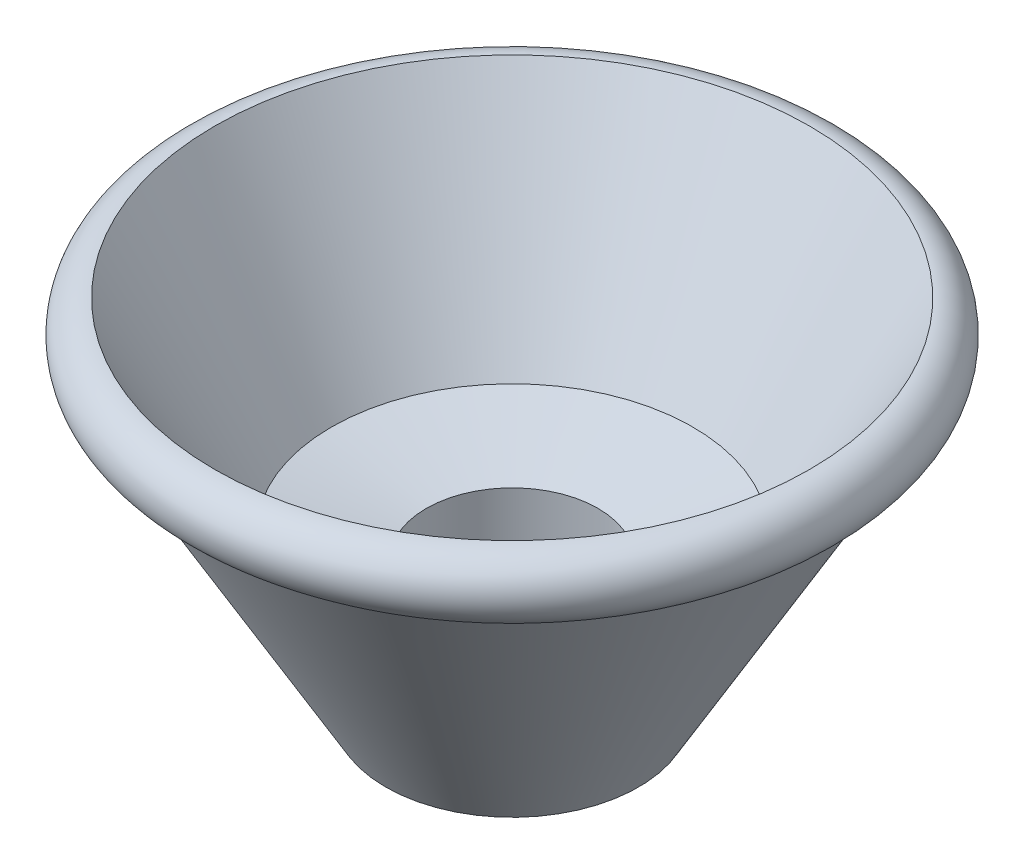
ISO-10303-21;
HEADER;
FILE_DESCRIPTION(('STEP AP214'),'2;1');
FILE_NAME('part.step','',(''),(''),'','','');
FILE_SCHEMA(('AUTOMOTIVE_DESIGN { 1 0 10303 214 1 1 1 1 }'));
ENDSEC;
DATA;
#1=APPLICATION_CONTEXT('core data for automotive mechanical design processes');
#2=APPLICATION_PROTOCOL_DEFINITION('international standard','automotive_design',2000,#1);
#3=PRODUCT_CONTEXT('',#1,'mechanical');
#4=PRODUCT('Part','Part','',(#3));
#5=PRODUCT_RELATED_PRODUCT_CATEGORY('part','',(#4));
#6=PRODUCT_DEFINITION_FORMATION('','',#4);
#7=PRODUCT_DEFINITION_CONTEXT('part definition',#1,'design');
#8=PRODUCT_DEFINITION('design','',#6,#7);
#9=PRODUCT_DEFINITION_SHAPE('','',#8);
#10=(LENGTH_UNIT() NAMED_UNIT(*) SI_UNIT(.MILLI.,.METRE.));
#11=(NAMED_UNIT(*) PLANE_ANGLE_UNIT() SI_UNIT($,.RADIAN.));
#12=(NAMED_UNIT(*) SI_UNIT($,.STERADIAN.) SOLID_ANGLE_UNIT());
#13=UNCERTAINTY_MEASURE_WITH_UNIT(LENGTH_MEASURE(1.E-05),#10,'distance_accuracy_value','');
#14=(GEOMETRIC_REPRESENTATION_CONTEXT(3) GLOBAL_UNCERTAINTY_ASSIGNED_CONTEXT((#13)) GLOBAL_UNIT_ASSIGNED_CONTEXT((#10,
#11,#12)) REPRESENTATION_CONTEXT('',''));
#15=CARTESIAN_POINT('',(0.,0.,0.));
#16=DIRECTION('',(0.,0.,1.));
#17=DIRECTION('',(1.,0.,0.));
#18=AXIS2_PLACEMENT_3D('',#15,#16,#17);
#19=CARTESIAN_POINT('',(0.,7.99999999999999,0.));
#20=DIRECTION('',(0.,1.,0.));
#21=DIRECTION('',(0.,0.,1.));
#22=AXIS2_PLACEMENT_3D('',#19,#20,#21);
#23=CONICAL_SURFACE('',#22,4.61880215351702,0.523598775598301);
#24=CARTESIAN_POINT('',(0.,7.99999999999999,0.));
#25=DIRECTION('',(0.,-1.,0.));
#26=DIRECTION('',(0.,0.,-1.));
#27=AXIS2_PLACEMENT_3D('',#24,#25,#26);
#28=CIRCLE('',#27,4.61880215351702);
#29=CARTESIAN_POINT('',(0.,7.99999999999999,-4.61880215351702));
#30=VERTEX_POINT('',#29);
#31=EDGE_CURVE('E46',#30,#30,#28,.T.);
#32=ORIENTED_EDGE('',*,*,#31,.T.);
#33=EDGE_LOOP('',(#32));
#34=FACE_BOUND('',#33,.T.);
#35=CARTESIAN_POINT('',(0.,3.40143097569881,0.));
#36=DIRECTION('',(0.,-1.,0.));
#37=DIRECTION('',(0.,0.,-1.));
#38=AXIS2_PLACEMENT_3D('',#35,#36,#37);
#39=CIRCLE('',#38,1.96381708944965);
#40=CARTESIAN_POINT('',(0.,3.40143097569881,-1.96381708944965));
#41=VERTEX_POINT('',#40);
#42=EDGE_CURVE('E66',#41,#41,#39,.T.);
#43=ORIENTED_EDGE('',*,*,#42,.F.);
#44=EDGE_LOOP('',(#43));
#45=FACE_BOUND('',#44,.T.);
#46=ADVANCED_FACE('F39',(#34,#45),#23,.T.);
#47=CARTESIAN_POINT('',(0.,7.99999999999999,0.));
#48=DIRECTION('',(0.,1.,0.));
#49=DIRECTION('',(-1.,0.,0.));
#50=AXIS2_PLACEMENT_3D('',#47,#48,#49);
#51=CONICAL_SURFACE('',#50,4.04145188432732,0.523598775598293);
#52=CARTESIAN_POINT('',(0.,5.85938316613098,0.));
#53=DIRECTION('',(0.,1.,0.));
#54=DIRECTION('',(-1.,0.,0.));
#55=AXIS2_PLACEMENT_3D('',#52,#53,#54);
#56=CIRCLE('',#55,2.80556617906123);
#57=CARTESIAN_POINT('',(-2.80556617906123,5.85938316613098,0.));
#58=VERTEX_POINT('',#57);
#59=EDGE_CURVE('E10',#58,#58,#56,.T.);
#60=ORIENTED_EDGE('',*,*,#59,.F.);
#61=EDGE_LOOP('',(#60));
#62=FACE_BOUND('',#61,.T.);
#63=CARTESIAN_POINT('',(0.,9.00000000000001,0.));
#64=DIRECTION('',(0.,-1.,0.));
#65=DIRECTION('',(0.,0.,-1.));
#66=AXIS2_PLACEMENT_3D('',#63,#64,#65);
#67=CIRCLE('',#66,4.61880215351696);
#68=CARTESIAN_POINT('',(0.,9.00000000000001,-4.61880215351696));
#69=VERTEX_POINT('',#68);
#70=EDGE_CURVE('E51',#69,#69,#67,.F.);
#71=ORIENTED_EDGE('',*,*,#70,.T.);
#72=EDGE_LOOP('',(#71));
#73=FACE_BOUND('',#72,.T.);
#74=ADVANCED_FACE('F99',(#62,#73),#51,.F.);
#75=CARTESIAN_POINT('',(0.,8.49999999999999,0.));
#76=DIRECTION('',(0.,-1.,0.));
#77=DIRECTION('',(0.,0.,-1.));
#78=AXIS2_PLACEMENT_3D('',#75,#76,#77);
#79=TOROIDAL_SURFACE('',#78,4.61880215351702,0.5);
#80=ORIENTED_EDGE('',*,*,#31,.F.);
#81=EDGE_LOOP('',(#80));
#82=FACE_BOUND('',#81,.T.);
#83=ORIENTED_EDGE('',*,*,#70,.F.);
#84=EDGE_LOOP('',(#83));
#85=FACE_BOUND('',#84,.T.);
#86=ADVANCED_FACE('F105',(#82,#85),#79,.T.);
#87=CARTESIAN_POINT('',(0.324999999999999,3.40143097569881,0.));
#88=DIRECTION('',(0.,-1.,0.));
#89=DIRECTION('',(0.,0.,-1.));
#90=AXIS2_PLACEMENT_3D('',#87,#88,#89);
#91=PLANE('',#90);
#92=CARTESIAN_POINT('',(0.,3.40143097569881,0.));
#93=DIRECTION('',(0.,-1.,0.));
#94=DIRECTION('',(0.,0.,-1.));
#95=AXIS2_PLACEMENT_3D('',#92,#93,#94);
#96=CIRCLE('',#95,0.324999999999999);
#97=CARTESIAN_POINT('',(0.,3.40143097569881,-0.324999999999999));
#98=VERTEX_POINT('',#97);
#99=EDGE_CURVE('E62',#98,#98,#96,.T.);
#100=ORIENTED_EDGE('',*,*,#99,.F.);
#101=EDGE_LOOP('',(#100));
#102=FACE_BOUND('',#101,.T.);
#103=ORIENTED_EDGE('',*,*,#42,.T.);
#104=EDGE_LOOP('',(#103));
#105=FACE_BOUND('',#104,.T.);
#106=ADVANCED_FACE('F110',(#102,#105),#91,.T.);
#107=CARTESIAN_POINT('',(0.324999999999999,3.75143097569881,0.));
#108=DIRECTION('',(0.,1.,0.));
#109=DIRECTION('',(0.,0.,1.));
#110=AXIS2_PLACEMENT_3D('',#107,#108,#109);
#111=PLANE('',#110);
#112=CARTESIAN_POINT('',(0.,3.75143097569881,0.));
#113=DIRECTION('',(0.,-1.,0.));
#114=DIRECTION('',(0.,0.,-1.));
#115=AXIS2_PLACEMENT_3D('',#112,#113,#114);
#116=CIRCLE('',#115,0.324999999999999);
#117=CARTESIAN_POINT('',(0.,3.75143097569881,-0.324999999999999));
#118=VERTEX_POINT('',#117);
#119=EDGE_CURVE('E56',#118,#118,#116,.T.);
#120=ORIENTED_EDGE('',*,*,#119,.T.);
#121=EDGE_LOOP('',(#120));
#122=FACE_BOUND('',#121,.T.);
#123=CARTESIAN_POINT('',(0.,3.7514309756988,0.));
#124=DIRECTION('',(0.,-1.,0.));
#125=DIRECTION('',(1.,0.,0.));
#126=AXIS2_PLACEMENT_3D('',#123,#124,#125);
#127=CIRCLE('',#126,1.58853941447636);
#128=CARTESIAN_POINT('',(1.58853941447636,3.7514309756988,0.));
#129=VERTEX_POINT('',#128);
#130=EDGE_CURVE('E70',#129,#129,#127,.T.);
#131=ORIENTED_EDGE('',*,*,#130,.F.);
#132=EDGE_LOOP('',(#131));
#133=FACE_BOUND('',#132,.T.);
#134=ADVANCED_FACE('F112',(#122,#133),#111,.T.);
#135=CARTESIAN_POINT('',(0.,0.,0.));
#136=DIRECTION('',(0.,-1.,0.));
#137=DIRECTION('',(0.,0.,-1.));
#138=AXIS2_PLACEMENT_3D('',#135,#136,#137);
#139=CYLINDRICAL_SURFACE('',#138,0.324999999999999);
#140=ORIENTED_EDGE('',*,*,#99,.T.);
#141=EDGE_LOOP('',(#140));
#142=FACE_BOUND('',#141,.T.);
#143=ORIENTED_EDGE('',*,*,#119,.F.);
#144=EDGE_LOOP('',(#143));
#145=FACE_BOUND('',#144,.T.);
#146=ADVANCED_FACE('F95',(#142,#145),#139,.F.);
#147=CARTESIAN_POINT('',(0.,0.0626446372648916,0.));
#148=DIRECTION('',(0.,-1.,0.));
#149=DIRECTION('',(1.,0.,0.));
#150=AXIS2_PLACEMENT_3D('',#147,#148,#149);
#151=CYLINDRICAL_SURFACE('',#150,1.58853941447636);
#152=ORIENTED_EDGE('',*,*,#130,.T.);
#153=EDGE_LOOP('',(#152));
#154=FACE_BOUND('',#153,.T.);
#155=CARTESIAN_POINT('',(0.,5.50116157520938,0.));
#156=DIRECTION('',(0.,-1.,0.));
#157=DIRECTION('',(1.,0.,0.));
#158=AXIS2_PLACEMENT_3D('',#155,#156,#157);
#159=CIRCLE('',#158,1.58853941447636);
#160=CARTESIAN_POINT('',(1.58853941447636,5.50116157520938,0.));
#161=VERTEX_POINT('',#160);
#162=EDGE_CURVE('E74',#161,#161,#159,.T.);
#163=ORIENTED_EDGE('',*,*,#162,.F.);
#164=EDGE_LOOP('',(#163));
#165=FACE_BOUND('',#164,.T.);
#166=ADVANCED_FACE('F87',(#154,#165),#151,.F.);
#167=CARTESIAN_POINT('',(1.33368380174045,5.50116157520938,0.));
#168=DIRECTION('',(0.,-1.,0.));
#169=DIRECTION('',(1.,0.,0.));
#170=AXIS2_PLACEMENT_3D('',#167,#168,#169);
#171=PLANE('',#170);
#172=ORIENTED_EDGE('',*,*,#162,.T.);
#173=EDGE_LOOP('',(#172));
#174=FACE_BOUND('',#173,.T.);
#175=CARTESIAN_POINT('',(0.,5.50116157520938,0.));
#176=DIRECTION('',(0.,-1.,0.));
#177=DIRECTION('',(1.,0.,0.));
#178=AXIS2_PLACEMENT_3D('',#175,#176,#177);
#179=CIRCLE('',#178,1.33368380174045);
#180=CARTESIAN_POINT('',(1.33368380174045,5.50116157520938,0.));
#181=VERTEX_POINT('',#180);
#182=EDGE_CURVE('E78',#181,#181,#179,.T.);
#183=ORIENTED_EDGE('',*,*,#182,.F.);
#184=EDGE_LOOP('',(#183));
#185=FACE_BOUND('',#184,.T.);
#186=ADVANCED_FACE('F85',(#174,#185),#171,.T.);
#187=CARTESIAN_POINT('',(0.,5.85938316613099,0.));
#188=DIRECTION('',(0.,1.,0.));
#189=DIRECTION('',(-1.,0.,0.));
#190=AXIS2_PLACEMENT_3D('',#187,#188,#189);
#191=CONICAL_SURFACE('',#190,2.80556617906123,1.3320611892742);
#192=ORIENTED_EDGE('',*,*,#182,.T.);
#193=EDGE_LOOP('',(#192));
#194=FACE_BOUND('',#193,.T.);
#195=ORIENTED_EDGE('',*,*,#59,.T.);
#196=EDGE_LOOP('',(#195));
#197=FACE_BOUND('',#196,.T.);
#198=ADVANCED_FACE('F83',(#194,#197),#191,.F.);
#199=CLOSED_SHELL('',(#46,#74,#86,#106,#134,#146,#166,#186,#198));
#200=MANIFOLD_SOLID_BREP('B2',#199);
#201=ADVANCED_BREP_SHAPE_REPRESENTATION('',(#18,#200),#14);
#202=SHAPE_DEFINITION_REPRESENTATION(#9,#201);
ENDSEC;
END-ISO-10303-21;
